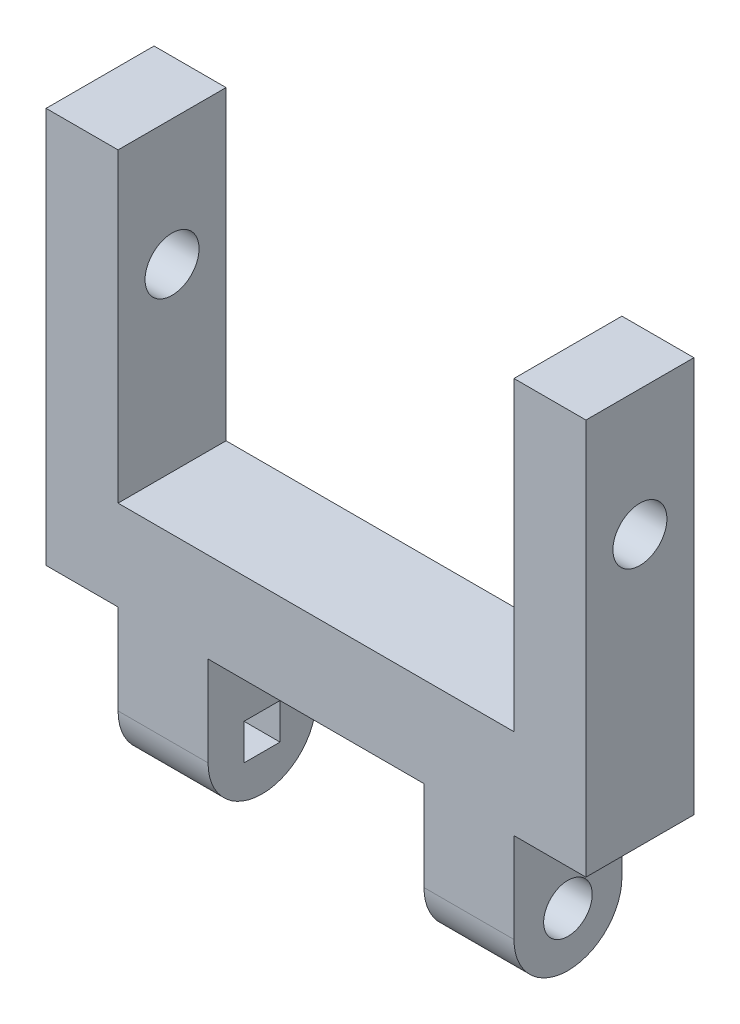
ISO-10303-21;
HEADER;
FILE_DESCRIPTION(('STEP AP214'),'2;1');
FILE_NAME('part.step','',(''),(''),'','','');
FILE_SCHEMA(('AUTOMOTIVE_DESIGN { 1 0 10303 214 1 1 1 1 }'));
ENDSEC;
DATA;
#1=APPLICATION_CONTEXT('core data for automotive mechanical design processes');
#2=APPLICATION_PROTOCOL_DEFINITION('international standard','automotive_design',2000,#1);
#3=PRODUCT_CONTEXT('',#1,'mechanical');
#4=PRODUCT('Part','Part','',(#3));
#5=PRODUCT_RELATED_PRODUCT_CATEGORY('part','',(#4));
#6=PRODUCT_DEFINITION_FORMATION('','',#4);
#7=PRODUCT_DEFINITION_CONTEXT('part definition',#1,'design');
#8=PRODUCT_DEFINITION('design','',#6,#7);
#9=PRODUCT_DEFINITION_SHAPE('','',#8);
#10=(LENGTH_UNIT() NAMED_UNIT(*) SI_UNIT(.MILLI.,.METRE.));
#11=(NAMED_UNIT(*) PLANE_ANGLE_UNIT() SI_UNIT($,.RADIAN.));
#12=(NAMED_UNIT(*) SI_UNIT($,.STERADIAN.) SOLID_ANGLE_UNIT());
#13=UNCERTAINTY_MEASURE_WITH_UNIT(LENGTH_MEASURE(1.E-05),#10,'distance_accuracy_value','');
#14=(GEOMETRIC_REPRESENTATION_CONTEXT(3) GLOBAL_UNCERTAINTY_ASSIGNED_CONTEXT((#13)) GLOBAL_UNIT_ASSIGNED_CONTEXT((#10,
#11,#12)) REPRESENTATION_CONTEXT('',''));
#15=CARTESIAN_POINT('',(0.,0.,0.));
#16=DIRECTION('',(0.,0.,1.));
#17=DIRECTION('',(1.,0.,0.));
#18=AXIS2_PLACEMENT_3D('',#15,#16,#17);
#19=CARTESIAN_POINT('',(0.,0.,0.));
#20=DIRECTION('',(0.,-1.,0.));
#21=DIRECTION('',(0.,0.,-1.));
#22=AXIS2_PLACEMENT_3D('',#19,#20,#21);
#23=PLANE('',#22);
#24=DIRECTION('',(1.,0.,0.));
#25=VECTOR('',#24,1.);
#26=CARTESIAN_POINT('',(-15.,0.,3.));
#27=LINE('',#26,#25);
#28=CARTESIAN_POINT('',(11.,0.,3.));
#29=VERTEX_POINT('',#28);
#30=CARTESIAN_POINT('',(15.,0.,3.));
#31=VERTEX_POINT('',#30);
#32=EDGE_CURVE('E365',#29,#31,#27,.T.);
#33=ORIENTED_EDGE('',*,*,#32,.F.);
#34=DIRECTION('',(0.,0.,1.));
#35=VECTOR('',#34,1.);
#36=CARTESIAN_POINT('',(11.,0.,-3.));
#37=LINE('',#36,#35);
#38=CARTESIAN_POINT('',(11.,0.,-3.));
#39=VERTEX_POINT('',#38);
#40=EDGE_CURVE('E255',#39,#29,#37,.T.);
#41=ORIENTED_EDGE('',*,*,#40,.F.);
#42=DIRECTION('',(-1.,0.,0.));
#43=VECTOR('',#42,1.);
#44=CARTESIAN_POINT('',(-15.,0.,-3.));
#45=LINE('',#44,#43);
#46=CARTESIAN_POINT('',(15.,0.,-3.));
#47=VERTEX_POINT('',#46);
#48=EDGE_CURVE('E357',#47,#39,#45,.T.);
#49=ORIENTED_EDGE('',*,*,#48,.F.);
#50=DIRECTION('',(0.,0.,-1.));
#51=VECTOR('',#50,1.);
#52=CARTESIAN_POINT('',(15.,0.,3.));
#53=LINE('',#52,#51);
#54=EDGE_CURVE('E344',#31,#47,#53,.T.);
#55=ORIENTED_EDGE('',*,*,#54,.F.);
#56=EDGE_LOOP('',(#33,#41,#49,#55));
#57=FACE_BOUND('',#56,.T.);
#58=ADVANCED_FACE('F43',(#57),#23,.T.);
#59=CARTESIAN_POINT('',(6.,0.,-3.));
#60=VERTEX_POINT('',#59);
#61=CARTESIAN_POINT('',(-6.,0.,-3.));
#62=VERTEX_POINT('',#61);
#63=EDGE_CURVE('E362',#60,#62,#45,.T.);
#64=ORIENTED_EDGE('',*,*,#63,.F.);
#65=DIRECTION('',(0.,0.,-1.));
#66=VECTOR('',#65,1.);
#67=CARTESIAN_POINT('',(6.,0.,-3.));
#68=LINE('',#67,#66);
#69=CARTESIAN_POINT('',(6.,0.,3.));
#70=VERTEX_POINT('',#69);
#71=EDGE_CURVE('E251',#70,#60,#68,.T.);
#72=ORIENTED_EDGE('',*,*,#71,.F.);
#73=CARTESIAN_POINT('',(-6.,0.,3.));
#74=VERTEX_POINT('',#73);
#75=EDGE_CURVE('E369',#74,#70,#27,.T.);
#76=ORIENTED_EDGE('',*,*,#75,.F.);
#77=DIRECTION('',(0.,0.,1.));
#78=VECTOR('',#77,1.);
#79=CARTESIAN_POINT('',(-6.,0.,-3.));
#80=LINE('',#79,#78);
#81=EDGE_CURVE('E263',#62,#74,#80,.T.);
#82=ORIENTED_EDGE('',*,*,#81,.F.);
#83=EDGE_LOOP('',(#64,#72,#76,#82));
#84=FACE_BOUND('',#83,.T.);
#85=ADVANCED_FACE('F471',(#84),#23,.T.);
#86=DIRECTION('',(0.,0.,-1.));
#87=VECTOR('',#86,1.);
#88=CARTESIAN_POINT('',(-11.,0.,-3.));
#89=LINE('',#88,#87);
#90=CARTESIAN_POINT('',(-11.,0.,3.));
#91=VERTEX_POINT('',#90);
#92=CARTESIAN_POINT('',(-11.,0.,-3.));
#93=VERTEX_POINT('',#92);
#94=EDGE_CURVE('E259',#91,#93,#89,.T.);
#95=ORIENTED_EDGE('',*,*,#94,.F.);
#96=CARTESIAN_POINT('',(-15.,0.,3.));
#97=VERTEX_POINT('',#96);
#98=EDGE_CURVE('E349',#97,#91,#27,.T.);
#99=ORIENTED_EDGE('',*,*,#98,.F.);
#100=DIRECTION('',(0.,0.,1.));
#101=VECTOR('',#100,1.);
#102=CARTESIAN_POINT('',(-15.,0.,3.));
#103=LINE('',#102,#101);
#104=CARTESIAN_POINT('',(-15.,0.,-3.));
#105=VERTEX_POINT('',#104);
#106=EDGE_CURVE('E361',#105,#97,#103,.T.);
#107=ORIENTED_EDGE('',*,*,#106,.F.);
#108=EDGE_CURVE('E356',#93,#105,#45,.T.);
#109=ORIENTED_EDGE('',*,*,#108,.F.);
#110=EDGE_LOOP('',(#95,#99,#107,#109));
#111=FACE_BOUND('',#110,.T.);
#112=ADVANCED_FACE('F492',(#111),#23,.T.);
#113=CARTESIAN_POINT('',(0.,5.,0.));
#114=DIRECTION('',(0.,-1.,0.));
#115=DIRECTION('',(0.,0.,-1.));
#116=AXIS2_PLACEMENT_3D('',#113,#114,#115);
#117=PLANE('',#116);
#118=DIRECTION('',(0.,0.,1.));
#119=VECTOR('',#118,1.);
#120=CARTESIAN_POINT('',(11.,5.,-3.));
#121=LINE('',#120,#119);
#122=CARTESIAN_POINT('',(11.,5.,-3.));
#123=VERTEX_POINT('',#122);
#124=CARTESIAN_POINT('',(11.,5.,3.));
#125=VERTEX_POINT('',#124);
#126=EDGE_CURVE('E301',#123,#125,#121,.T.);
#127=ORIENTED_EDGE('',*,*,#126,.F.);
#128=DIRECTION('',(-1.,0.,0.));
#129=VECTOR('',#128,1.);
#130=CARTESIAN_POINT('',(-15.,5.,-3.));
#131=LINE('',#130,#129);
#132=CARTESIAN_POINT('',(-11.,5.,-3.));
#133=VERTEX_POINT('',#132);
#134=EDGE_CURVE('E345',#123,#133,#131,.T.);
#135=ORIENTED_EDGE('',*,*,#134,.T.);
#136=DIRECTION('',(0.,0.,-1.));
#137=VECTOR('',#136,1.);
#138=CARTESIAN_POINT('',(-11.,5.,-3.));
#139=LINE('',#138,#137);
#140=CARTESIAN_POINT('',(-11.,5.,3.));
#141=VERTEX_POINT('',#140);
#142=EDGE_CURVE('E305',#141,#133,#139,.T.);
#143=ORIENTED_EDGE('',*,*,#142,.F.);
#144=DIRECTION('',(1.,0.,0.));
#145=VECTOR('',#144,1.);
#146=CARTESIAN_POINT('',(-15.,5.,3.));
#147=LINE('',#146,#145);
#148=EDGE_CURVE('E348',#141,#125,#147,.T.);
#149=ORIENTED_EDGE('',*,*,#148,.T.);
#150=EDGE_LOOP('',(#127,#135,#143,#149));
#151=FACE_BOUND('',#150,.T.);
#152=ADVANCED_FACE('F507',(#151),#117,.F.);
#153=CARTESIAN_POINT('',(15.,5.,3.));
#154=DIRECTION('',(-1.,0.,0.));
#155=DIRECTION('',(0.,0.,1.));
#156=AXIS2_PLACEMENT_3D('',#153,#154,#155);
#157=PLANE('',#156);
#158=CARTESIAN_POINT('',(15.,15.,0.));
#159=DIRECTION('',(-1.,0.,0.));
#160=DIRECTION('',(0.,0.,1.));
#161=AXIS2_PLACEMENT_3D('',#158,#159,#160);
#162=CIRCLE('',#161,1.5);
#163=CARTESIAN_POINT('',(15.,15.,1.5));
#164=VERTEX_POINT('',#163);
#165=EDGE_CURVE('E288',#164,#164,#162,.T.);
#166=ORIENTED_EDGE('',*,*,#165,.T.);
#167=EDGE_LOOP('',(#166));
#168=FACE_BOUND('',#167,.T.);
#169=ORIENTED_EDGE('',*,*,#54,.T.);
#170=DIRECTION('',(0.,-1.,0.));
#171=VECTOR('',#170,1.);
#172=CARTESIAN_POINT('',(15.,5.,-3.));
#173=LINE('',#172,#171);
#174=CARTESIAN_POINT('',(15.,22.,-3.));
#175=VERTEX_POINT('',#174);
#176=EDGE_CURVE('E381',#175,#47,#173,.T.);
#177=ORIENTED_EDGE('',*,*,#176,.F.);
#178=DIRECTION('',(0.,0.,-1.));
#179=VECTOR('',#178,1.);
#180=CARTESIAN_POINT('',(15.,22.,-3.));
#181=LINE('',#180,#179);
#182=CARTESIAN_POINT('',(15.,22.,3.));
#183=VERTEX_POINT('',#182);
#184=EDGE_CURVE('E306',#183,#175,#181,.T.);
#185=ORIENTED_EDGE('',*,*,#184,.F.);
#186=DIRECTION('',(0.,-1.,0.));
#187=VECTOR('',#186,1.);
#188=CARTESIAN_POINT('',(15.,5.,3.));
#189=LINE('',#188,#187);
#190=EDGE_CURVE('E352',#183,#31,#189,.T.);
#191=ORIENTED_EDGE('',*,*,#190,.T.);
#192=EDGE_LOOP('',(#169,#177,#185,#191));
#193=FACE_BOUND('',#192,.T.);
#194=ADVANCED_FACE('F518',(#168,#193),#157,.F.);
#195=CARTESIAN_POINT('',(-15.,5.,-3.));
#196=DIRECTION('',(0.,0.,1.));
#197=DIRECTION('',(1.,0.,0.));
#198=AXIS2_PLACEMENT_3D('',#195,#196,#197);
#199=PLANE('',#198);
#200=DIRECTION('',(0.,1.,0.));
#201=VECTOR('',#200,1.);
#202=CARTESIAN_POINT('',(-6.,-8.,-3.));
#203=LINE('',#202,#201);
#204=CARTESIAN_POINT('',(-6.,-5.,-3.));
#205=VERTEX_POINT('',#204);
#206=EDGE_CURVE('E273',#205,#62,#203,.T.);
#207=ORIENTED_EDGE('',*,*,#206,.F.);
#208=DIRECTION('',(1.,0.,0.));
#209=VECTOR('',#208,1.);
#210=CARTESIAN_POINT('',(-15.,-5.,-3.));
#211=LINE('',#210,#209);
#212=CARTESIAN_POINT('',(-11.,-5.,-3.));
#213=VERTEX_POINT('',#212);
#214=EDGE_CURVE('E414',#205,#213,#211,.F.);
#215=ORIENTED_EDGE('',*,*,#214,.T.);
#216=DIRECTION('',(0.,1.,0.));
#217=VECTOR('',#216,1.);
#218=CARTESIAN_POINT('',(-11.,-8.,-3.));
#219=LINE('',#218,#217);
#220=EDGE_CURVE('E276',#213,#93,#219,.T.);
#221=ORIENTED_EDGE('',*,*,#220,.T.);
#222=ORIENTED_EDGE('',*,*,#108,.T.);
#223=DIRECTION('',(0.,-1.,0.));
#224=VECTOR('',#223,1.);
#225=CARTESIAN_POINT('',(-15.,5.,-3.));
#226=LINE('',#225,#224);
#227=CARTESIAN_POINT('',(-15.,22.,-3.));
#228=VERTEX_POINT('',#227);
#229=EDGE_CURVE('E377',#228,#105,#226,.T.);
#230=ORIENTED_EDGE('',*,*,#229,.F.);
#231=DIRECTION('',(-1.,0.,0.));
#232=VECTOR('',#231,1.);
#233=CARTESIAN_POINT('',(-15.,22.,-3.));
#234=LINE('',#233,#232);
#235=CARTESIAN_POINT('',(-11.,22.,-3.));
#236=VERTEX_POINT('',#235);
#237=EDGE_CURVE('E329',#236,#228,#234,.T.);
#238=ORIENTED_EDGE('',*,*,#237,.F.);
#239=DIRECTION('',(0.,-1.,0.));
#240=VECTOR('',#239,1.);
#241=CARTESIAN_POINT('',(-11.,22.,-3.));
#242=LINE('',#241,#240);
#243=EDGE_CURVE('E333',#236,#133,#242,.T.);
#244=ORIENTED_EDGE('',*,*,#243,.T.);
#245=ORIENTED_EDGE('',*,*,#134,.F.);
#246=DIRECTION('',(0.,-1.,0.));
#247=VECTOR('',#246,1.);
#248=CARTESIAN_POINT('',(11.,22.,-3.));
#249=LINE('',#248,#247);
#250=CARTESIAN_POINT('',(11.,22.,-3.));
#251=VERTEX_POINT('',#250);
#252=EDGE_CURVE('E292',#251,#123,#249,.T.);
#253=ORIENTED_EDGE('',*,*,#252,.F.);
#254=DIRECTION('',(-1.,0.,0.));
#255=VECTOR('',#254,1.);
#256=CARTESIAN_POINT('',(15.,22.,-3.));
#257=LINE('',#256,#255);
#258=EDGE_CURVE('E313',#175,#251,#257,.T.);
#259=ORIENTED_EDGE('',*,*,#258,.F.);
#260=ORIENTED_EDGE('',*,*,#176,.T.);
#261=ORIENTED_EDGE('',*,*,#48,.T.);
#262=DIRECTION('',(0.,1.,0.));
#263=VECTOR('',#262,1.);
#264=CARTESIAN_POINT('',(11.,-8.,-3.));
#265=LINE('',#264,#263);
#266=CARTESIAN_POINT('',(11.,-5.,-3.));
#267=VERTEX_POINT('',#266);
#268=EDGE_CURVE('E248',#267,#39,#265,.T.);
#269=ORIENTED_EDGE('',*,*,#268,.F.);
#270=DIRECTION('',(1.,0.,0.));
#271=VECTOR('',#270,1.);
#272=CARTESIAN_POINT('',(6.,-5.,-3.));
#273=LINE('',#272,#271);
#274=CARTESIAN_POINT('',(6.,-5.,-3.));
#275=VERTEX_POINT('',#274);
#276=EDGE_CURVE('E410',#267,#275,#273,.F.);
#277=ORIENTED_EDGE('',*,*,#276,.T.);
#278=DIRECTION('',(0.,1.,0.));
#279=VECTOR('',#278,1.);
#280=CARTESIAN_POINT('',(6.,-8.,-3.));
#281=LINE('',#280,#279);
#282=EDGE_CURVE('E245',#275,#60,#281,.T.);
#283=ORIENTED_EDGE('',*,*,#282,.T.);
#284=ORIENTED_EDGE('',*,*,#63,.T.);
#285=EDGE_LOOP('',(#207,#215,#221,#222,#230,#238,#244,#245,#253,#259,#260,#261,#269,#277,#283,#284));
#286=FACE_BOUND('',#285,.T.);
#287=ADVANCED_FACE('F479',(#286),#199,.F.);
#288=CARTESIAN_POINT('',(-15.,5.,3.));
#289=DIRECTION('',(1.,0.,0.));
#290=DIRECTION('',(0.,0.,-1.));
#291=AXIS2_PLACEMENT_3D('',#288,#289,#290);
#292=PLANE('',#291);
#293=CARTESIAN_POINT('',(-15.,15.,0.));
#294=DIRECTION('',(1.,0.,0.));
#295=DIRECTION('',(0.,0.,-1.));
#296=AXIS2_PLACEMENT_3D('',#293,#294,#295);
#297=CIRCLE('',#296,1.5);
#298=CARTESIAN_POINT('',(-15.,15.,-1.5));
#299=VERTEX_POINT('',#298);
#300=EDGE_CURVE('E284',#299,#299,#297,.T.);
#301=ORIENTED_EDGE('',*,*,#300,.T.);
#302=EDGE_LOOP('',(#301));
#303=FACE_BOUND('',#302,.T.);
#304=ORIENTED_EDGE('',*,*,#106,.T.);
#305=DIRECTION('',(0.,-1.,0.));
#306=VECTOR('',#305,1.);
#307=CARTESIAN_POINT('',(-15.,5.,3.));
#308=LINE('',#307,#306);
#309=CARTESIAN_POINT('',(-15.,22.,3.));
#310=VERTEX_POINT('',#309);
#311=EDGE_CURVE('E373',#310,#97,#308,.T.);
#312=ORIENTED_EDGE('',*,*,#311,.F.);
#313=DIRECTION('',(0.,0.,1.));
#314=VECTOR('',#313,1.);
#315=CARTESIAN_POINT('',(-15.,22.,-3.));
#316=LINE('',#315,#314);
#317=EDGE_CURVE('E319',#228,#310,#316,.T.);
#318=ORIENTED_EDGE('',*,*,#317,.F.);
#319=ORIENTED_EDGE('',*,*,#229,.T.);
#320=EDGE_LOOP('',(#304,#312,#318,#319));
#321=FACE_BOUND('',#320,.T.);
#322=ADVANCED_FACE('F490',(#303,#321),#292,.F.);
#323=CARTESIAN_POINT('',(-15.,5.,3.));
#324=DIRECTION('',(0.,0.,-1.));
#325=DIRECTION('',(-1.,0.,0.));
#326=AXIS2_PLACEMENT_3D('',#323,#324,#325);
#327=PLANE('',#326);
#328=DIRECTION('',(0.,1.,0.));
#329=VECTOR('',#328,1.);
#330=CARTESIAN_POINT('',(6.,-8.,3.));
#331=LINE('',#330,#329);
#332=CARTESIAN_POINT('',(6.,-5.,3.));
#333=VERTEX_POINT('',#332);
#334=EDGE_CURVE('E242',#333,#70,#331,.T.);
#335=ORIENTED_EDGE('',*,*,#334,.F.);
#336=DIRECTION('',(-1.,0.,0.));
#337=VECTOR('',#336,1.);
#338=CARTESIAN_POINT('',(11.,-5.,3.));
#339=LINE('',#338,#337);
#340=CARTESIAN_POINT('',(11.,-5.,3.));
#341=VERTEX_POINT('',#340);
#342=EDGE_CURVE('E11',#333,#341,#339,.F.);
#343=ORIENTED_EDGE('',*,*,#342,.T.);
#344=DIRECTION('',(0.,1.,0.));
#345=VECTOR('',#344,1.);
#346=CARTESIAN_POINT('',(11.,-8.,3.));
#347=LINE('',#346,#345);
#348=EDGE_CURVE('E239',#341,#29,#347,.T.);
#349=ORIENTED_EDGE('',*,*,#348,.T.);
#350=ORIENTED_EDGE('',*,*,#32,.T.);
#351=ORIENTED_EDGE('',*,*,#190,.F.);
#352=DIRECTION('',(1.,0.,0.));
#353=VECTOR('',#352,1.);
#354=CARTESIAN_POINT('',(15.,22.,3.));
#355=LINE('',#354,#353);
#356=CARTESIAN_POINT('',(11.,22.,3.));
#357=VERTEX_POINT('',#356);
#358=EDGE_CURVE('E300',#357,#183,#355,.T.);
#359=ORIENTED_EDGE('',*,*,#358,.F.);
#360=DIRECTION('',(0.,-1.,0.));
#361=VECTOR('',#360,1.);
#362=CARTESIAN_POINT('',(11.,22.,3.));
#363=LINE('',#362,#361);
#364=EDGE_CURVE('E296',#357,#125,#363,.T.);
#365=ORIENTED_EDGE('',*,*,#364,.T.);
#366=ORIENTED_EDGE('',*,*,#148,.F.);
#367=DIRECTION('',(0.,-1.,0.));
#368=VECTOR('',#367,1.);
#369=CARTESIAN_POINT('',(-11.,22.,3.));
#370=LINE('',#369,#368);
#371=CARTESIAN_POINT('',(-11.,22.,3.));
#372=VERTEX_POINT('',#371);
#373=EDGE_CURVE('E340',#372,#141,#370,.T.);
#374=ORIENTED_EDGE('',*,*,#373,.F.);
#375=DIRECTION('',(1.,0.,0.));
#376=VECTOR('',#375,1.);
#377=CARTESIAN_POINT('',(-15.,22.,3.));
#378=LINE('',#377,#376);
#379=EDGE_CURVE('E323',#310,#372,#378,.T.);
#380=ORIENTED_EDGE('',*,*,#379,.F.);
#381=ORIENTED_EDGE('',*,*,#311,.T.);
#382=ORIENTED_EDGE('',*,*,#98,.T.);
#383=DIRECTION('',(0.,1.,0.));
#384=VECTOR('',#383,1.);
#385=CARTESIAN_POINT('',(-11.,-8.,3.));
#386=LINE('',#385,#384);
#387=CARTESIAN_POINT('',(-11.,-5.,3.));
#388=VERTEX_POINT('',#387);
#389=EDGE_CURVE('E267',#388,#91,#386,.T.);
#390=ORIENTED_EDGE('',*,*,#389,.F.);
#391=DIRECTION('',(-1.,0.,0.));
#392=VECTOR('',#391,1.);
#393=CARTESIAN_POINT('',(-15.,-5.,3.));
#394=LINE('',#393,#392);
#395=CARTESIAN_POINT('',(-6.,-5.,3.));
#396=VERTEX_POINT('',#395);
#397=EDGE_CURVE('E53',#388,#396,#394,.F.);
#398=ORIENTED_EDGE('',*,*,#397,.T.);
#399=DIRECTION('',(0.,1.,0.));
#400=VECTOR('',#399,1.);
#401=CARTESIAN_POINT('',(-6.,-8.,3.));
#402=LINE('',#401,#400);
#403=EDGE_CURVE('E270',#396,#74,#402,.T.);
#404=ORIENTED_EDGE('',*,*,#403,.T.);
#405=ORIENTED_EDGE('',*,*,#75,.T.);
#406=EDGE_LOOP('',(#335,#343,#349,#350,#351,#359,#365,#366,#374,#380,#381,#382,#390,#398,#404,#405));
#407=FACE_BOUND('',#406,.T.);
#408=ADVANCED_FACE('F454',(#407),#327,.F.);
#409=CARTESIAN_POINT('',(-11.,22.,-3.));
#410=DIRECTION('',(-1.,0.,0.));
#411=DIRECTION('',(0.,0.,1.));
#412=AXIS2_PLACEMENT_3D('',#409,#410,#411);
#413=PLANE('',#412);
#414=CARTESIAN_POINT('',(-11.,15.,0.));
#415=DIRECTION('',(-1.,0.,0.));
#416=DIRECTION('',(0.,0.,1.));
#417=AXIS2_PLACEMENT_3D('',#414,#415,#416);
#418=CIRCLE('',#417,1.5);
#419=CARTESIAN_POINT('',(-11.,15.,1.5));
#420=VERTEX_POINT('',#419);
#421=EDGE_CURVE('E280',#420,#420,#418,.T.);
#422=ORIENTED_EDGE('',*,*,#421,.T.);
#423=EDGE_LOOP('',(#422));
#424=FACE_BOUND('',#423,.T.);
#425=ORIENTED_EDGE('',*,*,#142,.T.);
#426=ORIENTED_EDGE('',*,*,#243,.F.);
#427=DIRECTION('',(0.,0.,-1.));
#428=VECTOR('',#427,1.);
#429=CARTESIAN_POINT('',(-11.,22.,-3.));
#430=LINE('',#429,#428);
#431=EDGE_CURVE('E326',#372,#236,#430,.T.);
#432=ORIENTED_EDGE('',*,*,#431,.F.);
#433=ORIENTED_EDGE('',*,*,#373,.T.);
#434=EDGE_LOOP('',(#425,#426,#432,#433));
#435=FACE_BOUND('',#434,.T.);
#436=ADVANCED_FACE('F505',(#424,#435),#413,.F.);
#437=CARTESIAN_POINT('',(0.,22.,0.));
#438=DIRECTION('',(0.,1.,0.));
#439=DIRECTION('',(0.,0.,1.));
#440=AXIS2_PLACEMENT_3D('',#437,#438,#439);
#441=PLANE('',#440);
#442=ORIENTED_EDGE('',*,*,#317,.T.);
#443=ORIENTED_EDGE('',*,*,#379,.T.);
#444=ORIENTED_EDGE('',*,*,#431,.T.);
#445=ORIENTED_EDGE('',*,*,#237,.T.);
#446=EDGE_LOOP('',(#442,#443,#444,#445));
#447=FACE_BOUND('',#446,.T.);
#448=ADVANCED_FACE('F500',(#447),#441,.T.);
#449=CARTESIAN_POINT('',(11.,22.,-3.));
#450=DIRECTION('',(1.,0.,0.));
#451=DIRECTION('',(0.,0.,-1.));
#452=AXIS2_PLACEMENT_3D('',#449,#450,#451);
#453=PLANE('',#452);
#454=CARTESIAN_POINT('',(11.,15.,0.));
#455=DIRECTION('',(1.,0.,0.));
#456=DIRECTION('',(0.,0.,-1.));
#457=AXIS2_PLACEMENT_3D('',#454,#455,#456);
#458=CIRCLE('',#457,1.5);
#459=CARTESIAN_POINT('',(11.,15.,-1.5));
#460=VERTEX_POINT('',#459);
#461=EDGE_CURVE('E279',#460,#460,#458,.T.);
#462=ORIENTED_EDGE('',*,*,#461,.T.);
#463=EDGE_LOOP('',(#462));
#464=FACE_BOUND('',#463,.T.);
#465=ORIENTED_EDGE('',*,*,#126,.T.);
#466=ORIENTED_EDGE('',*,*,#364,.F.);
#467=DIRECTION('',(0.,0.,1.));
#468=VECTOR('',#467,1.);
#469=CARTESIAN_POINT('',(11.,22.,-3.));
#470=LINE('',#469,#468);
#471=EDGE_CURVE('E310',#251,#357,#470,.T.);
#472=ORIENTED_EDGE('',*,*,#471,.F.);
#473=ORIENTED_EDGE('',*,*,#252,.T.);
#474=EDGE_LOOP('',(#465,#466,#472,#473));
#475=FACE_BOUND('',#474,.T.);
#476=ADVANCED_FACE('F512',(#464,#475),#453,.F.);
#477=CARTESIAN_POINT('',(0.,22.,0.));
#478=DIRECTION('',(0.,-1.,0.));
#479=DIRECTION('',(0.,0.,-1.));
#480=AXIS2_PLACEMENT_3D('',#477,#478,#479);
#481=PLANE('',#480);
#482=ORIENTED_EDGE('',*,*,#184,.T.);
#483=ORIENTED_EDGE('',*,*,#258,.T.);
#484=ORIENTED_EDGE('',*,*,#471,.T.);
#485=ORIENTED_EDGE('',*,*,#358,.T.);
#486=EDGE_LOOP('',(#482,#483,#484,#485));
#487=FACE_BOUND('',#486,.T.);
#488=ADVANCED_FACE('F516',(#487),#481,.F.);
#489=CARTESIAN_POINT('',(61.,15.,0.));
#490=DIRECTION('',(-1.,0.,0.));
#491=DIRECTION('',(0.,0.,1.));
#492=AXIS2_PLACEMENT_3D('',#489,#490,#491);
#493=CYLINDRICAL_SURFACE('',#492,1.5);
#494=ORIENTED_EDGE('',*,*,#461,.F.);
#495=EDGE_LOOP('',(#494));
#496=FACE_BOUND('',#495,.T.);
#497=ORIENTED_EDGE('',*,*,#165,.F.);
#498=EDGE_LOOP('',(#497));
#499=FACE_BOUND('',#498,.T.);
#500=ADVANCED_FACE('F569',(#496,#499),#493,.F.);
#501=ORIENTED_EDGE('',*,*,#421,.F.);
#502=EDGE_LOOP('',(#501));
#503=FACE_BOUND('',#502,.T.);
#504=ORIENTED_EDGE('',*,*,#300,.F.);
#505=EDGE_LOOP('',(#504));
#506=FACE_BOUND('',#505,.T.);
#507=ADVANCED_FACE('F615',(#503,#506),#493,.F.);
#508=CARTESIAN_POINT('',(-11.,-8.,-3.));
#509=DIRECTION('',(1.,0.,0.));
#510=DIRECTION('',(0.,0.,-1.));
#511=AXIS2_PLACEMENT_3D('',#508,#509,#510);
#512=PLANE('',#511);
#513=DIRECTION('',(0.,0.,-1.));
#514=VECTOR('',#513,1.);
#515=CARTESIAN_POINT('',(-11.,-4.,-1.));
#516=LINE('',#515,#514);
#517=CARTESIAN_POINT('',(-11.,-4.,1.));
#518=VERTEX_POINT('',#517);
#519=CARTESIAN_POINT('',(-11.,-4.,-1.));
#520=VERTEX_POINT('',#519);
#521=EDGE_CURVE('E209',#518,#520,#516,.T.);
#522=ORIENTED_EDGE('',*,*,#521,.F.);
#523=DIRECTION('',(0.,1.,0.));
#524=VECTOR('',#523,1.);
#525=CARTESIAN_POINT('',(-11.,-6.,1.));
#526=LINE('',#525,#524);
#527=CARTESIAN_POINT('',(-11.,-6.,1.));
#528=VERTEX_POINT('',#527);
#529=EDGE_CURVE('E215',#528,#518,#526,.T.);
#530=ORIENTED_EDGE('',*,*,#529,.F.);
#531=DIRECTION('',(0.,0.,1.));
#532=VECTOR('',#531,1.);
#533=CARTESIAN_POINT('',(-11.,-6.,-1.));
#534=LINE('',#533,#532);
#535=CARTESIAN_POINT('',(-11.,-6.,-1.));
#536=VERTEX_POINT('',#535);
#537=EDGE_CURVE('E220',#536,#528,#534,.T.);
#538=ORIENTED_EDGE('',*,*,#537,.F.);
#539=DIRECTION('',(0.,-1.,0.));
#540=VECTOR('',#539,1.);
#541=CARTESIAN_POINT('',(-11.,-6.,-1.));
#542=LINE('',#541,#540);
#543=EDGE_CURVE('E197',#520,#536,#542,.T.);
#544=ORIENTED_EDGE('',*,*,#543,.F.);
#545=EDGE_LOOP('',(#522,#530,#538,#544));
#546=FACE_BOUND('',#545,.T.);
#547=ORIENTED_EDGE('',*,*,#220,.F.);
#548=CARTESIAN_POINT('',(-11.,-5.,0.));
#549=DIRECTION('',(1.,0.,0.));
#550=DIRECTION('',(0.,0.,-1.));
#551=AXIS2_PLACEMENT_3D('',#548,#549,#550);
#552=CIRCLE('',#551,3.);
#553=CARTESIAN_POINT('',(-11.,-8.,0.));
#554=VERTEX_POINT('',#553);
#555=EDGE_CURVE('E421',#213,#554,#552,.F.);
#556=ORIENTED_EDGE('',*,*,#555,.T.);
#557=CARTESIAN_POINT('',(-11.,-5.,0.));
#558=DIRECTION('',(1.,0.,0.));
#559=DIRECTION('',(0.,0.,-1.));
#560=AXIS2_PLACEMENT_3D('',#557,#558,#559);
#561=CIRCLE('',#560,3.);
#562=EDGE_CURVE('E418',#554,#388,#561,.F.);
#563=ORIENTED_EDGE('',*,*,#562,.T.);
#564=ORIENTED_EDGE('',*,*,#389,.T.);
#565=ORIENTED_EDGE('',*,*,#94,.T.);
#566=EDGE_LOOP('',(#547,#556,#563,#564,#565));
#567=FACE_BOUND('',#566,.T.);
#568=ADVANCED_FACE('F217',(#546,#567),#512,.F.);
#569=CARTESIAN_POINT('',(-6.,-8.,-3.));
#570=DIRECTION('',(-1.,0.,0.));
#571=DIRECTION('',(0.,0.,1.));
#572=AXIS2_PLACEMENT_3D('',#569,#570,#571);
#573=PLANE('',#572);
#574=DIRECTION('',(0.,0.,1.));
#575=VECTOR('',#574,1.);
#576=CARTESIAN_POINT('',(-6.,-6.,-3.));
#577=LINE('',#576,#575);
#578=CARTESIAN_POINT('',(-6.,-6.,-1.));
#579=VERTEX_POINT('',#578);
#580=CARTESIAN_POINT('',(-6.,-6.,1.));
#581=VERTEX_POINT('',#580);
#582=EDGE_CURVE('E396',#579,#581,#577,.T.);
#583=ORIENTED_EDGE('',*,*,#582,.T.);
#584=DIRECTION('',(0.,1.,0.));
#585=VECTOR('',#584,1.);
#586=CARTESIAN_POINT('',(-6.,-8.,1.));
#587=LINE('',#586,#585);
#588=CARTESIAN_POINT('',(-6.,-4.,1.));
#589=VERTEX_POINT('',#588);
#590=EDGE_CURVE('E400',#581,#589,#587,.T.);
#591=ORIENTED_EDGE('',*,*,#590,.T.);
#592=DIRECTION('',(0.,0.,-1.));
#593=VECTOR('',#592,1.);
#594=CARTESIAN_POINT('',(-6.,-4.,-3.));
#595=LINE('',#594,#593);
#596=CARTESIAN_POINT('',(-6.,-4.,-1.));
#597=VERTEX_POINT('',#596);
#598=EDGE_CURVE('E385',#589,#597,#595,.T.);
#599=ORIENTED_EDGE('',*,*,#598,.T.);
#600=DIRECTION('',(0.,-1.,0.));
#601=VECTOR('',#600,1.);
#602=CARTESIAN_POINT('',(-6.,-8.,-1.));
#603=LINE('',#602,#601);
#604=EDGE_CURVE('E200',#597,#579,#603,.T.);
#605=ORIENTED_EDGE('',*,*,#604,.T.);
#606=EDGE_LOOP('',(#583,#591,#599,#605));
#607=FACE_BOUND('',#606,.T.);
#608=CARTESIAN_POINT('',(-6.,-5.,0.));
#609=DIRECTION('',(-1.,0.,0.));
#610=DIRECTION('',(0.,0.,1.));
#611=AXIS2_PLACEMENT_3D('',#608,#609,#610);
#612=CIRCLE('',#611,3.);
#613=CARTESIAN_POINT('',(-6.,-8.,0.));
#614=VERTEX_POINT('',#613);
#615=EDGE_CURVE('E404',#396,#614,#612,.F.);
#616=ORIENTED_EDGE('',*,*,#615,.T.);
#617=CARTESIAN_POINT('',(-6.,-5.,0.));
#618=DIRECTION('',(-1.,0.,0.));
#619=DIRECTION('',(0.,0.,1.));
#620=AXIS2_PLACEMENT_3D('',#617,#618,#619);
#621=CIRCLE('',#620,3.);
#622=EDGE_CURVE('E407',#614,#205,#621,.F.);
#623=ORIENTED_EDGE('',*,*,#622,.T.);
#624=ORIENTED_EDGE('',*,*,#206,.T.);
#625=ORIENTED_EDGE('',*,*,#81,.T.);
#626=ORIENTED_EDGE('',*,*,#403,.F.);
#627=EDGE_LOOP('',(#616,#623,#624,#625,#626));
#628=FACE_BOUND('',#627,.T.);
#629=ADVANCED_FACE('F473',(#607,#628),#573,.F.);
#630=CARTESIAN_POINT('',(11.,-8.,-3.));
#631=DIRECTION('',(-1.,0.,0.));
#632=DIRECTION('',(0.,0.,1.));
#633=AXIS2_PLACEMENT_3D('',#630,#631,#632);
#634=PLANE('',#633);
#635=CARTESIAN_POINT('',(11.,-5.,0.));
#636=DIRECTION('',(1.,0.,0.));
#637=DIRECTION('',(0.,0.,-1.));
#638=AXIS2_PLACEMENT_3D('',#635,#636,#637);
#639=CIRCLE('',#638,1.35);
#640=CARTESIAN_POINT('',(11.,-5.,-1.35));
#641=VERTEX_POINT('',#640);
#642=EDGE_CURVE('E230',#641,#641,#639,.T.);
#643=ORIENTED_EDGE('',*,*,#642,.F.);
#644=EDGE_LOOP('',(#643));
#645=FACE_BOUND('',#644,.T.);
#646=CARTESIAN_POINT('',(11.,-5.,0.));
#647=DIRECTION('',(-1.,0.,0.));
#648=DIRECTION('',(0.,0.,1.));
#649=AXIS2_PLACEMENT_3D('',#646,#647,#648);
#650=CIRCLE('',#649,3.);
#651=CARTESIAN_POINT('',(11.,-8.,0.));
#652=VERTEX_POINT('',#651);
#653=EDGE_CURVE('E424',#341,#652,#650,.F.);
#654=ORIENTED_EDGE('',*,*,#653,.T.);
#655=CARTESIAN_POINT('',(11.,-5.,0.));
#656=DIRECTION('',(-1.,0.,0.));
#657=DIRECTION('',(0.,0.,1.));
#658=AXIS2_PLACEMENT_3D('',#655,#656,#657);
#659=CIRCLE('',#658,3.);
#660=EDGE_CURVE('E427',#652,#267,#659,.F.);
#661=ORIENTED_EDGE('',*,*,#660,.T.);
#662=ORIENTED_EDGE('',*,*,#268,.T.);
#663=ORIENTED_EDGE('',*,*,#40,.T.);
#664=ORIENTED_EDGE('',*,*,#348,.F.);
#665=EDGE_LOOP('',(#654,#661,#662,#663,#664));
#666=FACE_BOUND('',#665,.T.);
#667=ADVANCED_FACE('F457',(#645,#666),#634,.F.);
#668=CARTESIAN_POINT('',(6.,-8.,-3.));
#669=DIRECTION('',(1.,0.,0.));
#670=DIRECTION('',(0.,0.,-1.));
#671=AXIS2_PLACEMENT_3D('',#668,#669,#670);
#672=PLANE('',#671);
#673=CARTESIAN_POINT('',(6.,-5.,0.));
#674=DIRECTION('',(1.,0.,0.));
#675=DIRECTION('',(0.,0.,-1.));
#676=AXIS2_PLACEMENT_3D('',#673,#674,#675);
#677=CIRCLE('',#676,1.35);
#678=CARTESIAN_POINT('',(6.,-5.,-1.35));
#679=VERTEX_POINT('',#678);
#680=EDGE_CURVE('E238',#679,#679,#677,.T.);
#681=ORIENTED_EDGE('',*,*,#680,.T.);
#682=EDGE_LOOP('',(#681));
#683=FACE_BOUND('',#682,.T.);
#684=ORIENTED_EDGE('',*,*,#282,.F.);
#685=CARTESIAN_POINT('',(6.,-5.,0.));
#686=DIRECTION('',(1.,0.,0.));
#687=DIRECTION('',(0.,0.,-1.));
#688=AXIS2_PLACEMENT_3D('',#685,#686,#687);
#689=CIRCLE('',#688,3.);
#690=CARTESIAN_POINT('',(6.,-8.,0.));
#691=VERTEX_POINT('',#690);
#692=EDGE_CURVE('E66',#275,#691,#689,.F.);
#693=ORIENTED_EDGE('',*,*,#692,.T.);
#694=CARTESIAN_POINT('',(6.,-5.,0.));
#695=DIRECTION('',(1.,0.,0.));
#696=DIRECTION('',(0.,0.,-1.));
#697=AXIS2_PLACEMENT_3D('',#694,#695,#696);
#698=CIRCLE('',#697,3.);
#699=EDGE_CURVE('E61',#691,#333,#698,.F.);
#700=ORIENTED_EDGE('',*,*,#699,.T.);
#701=ORIENTED_EDGE('',*,*,#334,.T.);
#702=ORIENTED_EDGE('',*,*,#71,.T.);
#703=EDGE_LOOP('',(#684,#693,#700,#701,#702));
#704=FACE_BOUND('',#703,.T.);
#705=ADVANCED_FACE('F719',(#683,#704),#672,.F.);
#706=CARTESIAN_POINT('',(3.,-5.,0.));
#707=DIRECTION('',(1.,0.,0.));
#708=DIRECTION('',(0.,0.,-1.));
#709=AXIS2_PLACEMENT_3D('',#706,#707,#708);
#710=CYLINDRICAL_SURFACE('',#709,1.35);
#711=ORIENTED_EDGE('',*,*,#642,.T.);
#712=EDGE_LOOP('',(#711));
#713=FACE_BOUND('',#712,.T.);
#714=ORIENTED_EDGE('',*,*,#680,.F.);
#715=EDGE_LOOP('',(#714));
#716=FACE_BOUND('',#715,.T.);
#717=ADVANCED_FACE('F730',(#713,#716),#710,.F.);
#718=CARTESIAN_POINT('',(-3.,-6.,1.));
#719=DIRECTION('',(0.,0.,1.));
#720=DIRECTION('',(1.,0.,0.));
#721=AXIS2_PLACEMENT_3D('',#718,#719,#720);
#722=PLANE('',#721);
#723=DIRECTION('',(-1.,0.,0.));
#724=VECTOR('',#723,1.);
#725=CARTESIAN_POINT('',(-3.,-6.,1.));
#726=LINE('',#725,#724);
#727=EDGE_CURVE('E227',#581,#528,#726,.T.);
#728=ORIENTED_EDGE('',*,*,#727,.T.);
#729=ORIENTED_EDGE('',*,*,#529,.T.);
#730=DIRECTION('',(-1.,0.,0.));
#731=VECTOR('',#730,1.);
#732=CARTESIAN_POINT('',(-3.,-4.,1.));
#733=LINE('',#732,#731);
#734=EDGE_CURVE('E205',#589,#518,#733,.T.);
#735=ORIENTED_EDGE('',*,*,#734,.F.);
#736=ORIENTED_EDGE('',*,*,#590,.F.);
#737=EDGE_LOOP('',(#728,#729,#735,#736));
#738=FACE_BOUND('',#737,.T.);
#739=ADVANCED_FACE('F741',(#738),#722,.F.);
#740=CARTESIAN_POINT('',(-3.,-6.,-1.));
#741=DIRECTION('',(0.,-1.,0.));
#742=DIRECTION('',(0.,0.,-1.));
#743=AXIS2_PLACEMENT_3D('',#740,#741,#742);
#744=PLANE('',#743);
#745=DIRECTION('',(-1.,0.,0.));
#746=VECTOR('',#745,1.);
#747=CARTESIAN_POINT('',(-3.,-6.,-1.));
#748=LINE('',#747,#746);
#749=EDGE_CURVE('E204',#579,#536,#748,.T.);
#750=ORIENTED_EDGE('',*,*,#749,.T.);
#751=ORIENTED_EDGE('',*,*,#537,.T.);
#752=ORIENTED_EDGE('',*,*,#727,.F.);
#753=ORIENTED_EDGE('',*,*,#582,.F.);
#754=EDGE_LOOP('',(#750,#751,#752,#753));
#755=FACE_BOUND('',#754,.T.);
#756=ADVANCED_FACE('F752',(#755),#744,.F.);
#757=CARTESIAN_POINT('',(-3.,-6.,-1.));
#758=DIRECTION('',(0.,0.,-1.));
#759=DIRECTION('',(-1.,0.,0.));
#760=AXIS2_PLACEMENT_3D('',#757,#758,#759);
#761=PLANE('',#760);
#762=DIRECTION('',(-1.,0.,0.));
#763=VECTOR('',#762,1.);
#764=CARTESIAN_POINT('',(-3.,-4.,-1.));
#765=LINE('',#764,#763);
#766=EDGE_CURVE('E192',#597,#520,#765,.T.);
#767=ORIENTED_EDGE('',*,*,#766,.T.);
#768=ORIENTED_EDGE('',*,*,#543,.T.);
#769=ORIENTED_EDGE('',*,*,#749,.F.);
#770=ORIENTED_EDGE('',*,*,#604,.F.);
#771=EDGE_LOOP('',(#767,#768,#769,#770));
#772=FACE_BOUND('',#771,.T.);
#773=ADVANCED_FACE('F194',(#772),#761,.F.);
#774=CARTESIAN_POINT('',(-3.,-4.,-1.));
#775=DIRECTION('',(0.,1.,0.));
#776=DIRECTION('',(0.,0.,1.));
#777=AXIS2_PLACEMENT_3D('',#774,#775,#776);
#778=PLANE('',#777);
#779=ORIENTED_EDGE('',*,*,#734,.T.);
#780=ORIENTED_EDGE('',*,*,#521,.T.);
#781=ORIENTED_EDGE('',*,*,#766,.F.);
#782=ORIENTED_EDGE('',*,*,#598,.F.);
#783=EDGE_LOOP('',(#779,#780,#781,#782));
#784=FACE_BOUND('',#783,.T.);
#785=ADVANCED_FACE('F210',(#784),#778,.F.);
#786=CARTESIAN_POINT('',(0.,-5.,0.));
#787=DIRECTION('',(-1.,0.,0.));
#788=DIRECTION('',(0.,0.,1.));
#789=AXIS2_PLACEMENT_3D('',#786,#787,#788);
#790=CYLINDRICAL_SURFACE('',#789,3.);
#791=ORIENTED_EDGE('',*,*,#397,.F.);
#792=ORIENTED_EDGE('',*,*,#562,.F.);
#793=DIRECTION('',(-1.,0.,0.));
#794=VECTOR('',#793,1.);
#795=CARTESIAN_POINT('',(0.,-8.,0.));
#796=LINE('',#795,#794);
#797=EDGE_CURVE('E435',#614,#554,#796,.T.);
#798=ORIENTED_EDGE('',*,*,#797,.F.);
#799=ORIENTED_EDGE('',*,*,#615,.F.);
#800=EDGE_LOOP('',(#791,#792,#798,#799));
#801=FACE_BOUND('',#800,.T.);
#802=ADVANCED_FACE('F781',(#801),#790,.T.);
#803=CARTESIAN_POINT('',(0.,-5.,0.));
#804=DIRECTION('',(1.,0.,0.));
#805=DIRECTION('',(0.,0.,-1.));
#806=AXIS2_PLACEMENT_3D('',#803,#804,#805);
#807=CYLINDRICAL_SURFACE('',#806,3.);
#808=ORIENTED_EDGE('',*,*,#555,.F.);
#809=ORIENTED_EDGE('',*,*,#214,.F.);
#810=ORIENTED_EDGE('',*,*,#622,.F.);
#811=ORIENTED_EDGE('',*,*,#797,.T.);
#812=EDGE_LOOP('',(#808,#809,#810,#811));
#813=FACE_BOUND('',#812,.T.);
#814=ADVANCED_FACE('F790',(#813),#807,.T.);
#815=CARTESIAN_POINT('',(0.,-5.,0.));
#816=DIRECTION('',(1.,0.,0.));
#817=DIRECTION('',(0.,0.,-1.));
#818=AXIS2_PLACEMENT_3D('',#815,#816,#817);
#819=CYLINDRICAL_SURFACE('',#818,3.);
#820=ORIENTED_EDGE('',*,*,#342,.F.);
#821=ORIENTED_EDGE('',*,*,#699,.F.);
#822=DIRECTION('',(-1.,0.,0.));
#823=VECTOR('',#822,1.);
#824=CARTESIAN_POINT('',(6.,-8.,0.));
#825=LINE('',#824,#823);
#826=EDGE_CURVE('E47',#652,#691,#825,.T.);
#827=ORIENTED_EDGE('',*,*,#826,.F.);
#828=ORIENTED_EDGE('',*,*,#653,.F.);
#829=EDGE_LOOP('',(#820,#821,#827,#828));
#830=FACE_BOUND('',#829,.T.);
#831=ADVANCED_FACE('F45',(#830),#819,.T.);
#832=CARTESIAN_POINT('',(0.,-5.,0.));
#833=DIRECTION('',(-1.,0.,0.));
#834=DIRECTION('',(0.,0.,1.));
#835=AXIS2_PLACEMENT_3D('',#832,#833,#834);
#836=CYLINDRICAL_SURFACE('',#835,3.);
#837=ORIENTED_EDGE('',*,*,#692,.F.);
#838=ORIENTED_EDGE('',*,*,#276,.F.);
#839=ORIENTED_EDGE('',*,*,#660,.F.);
#840=ORIENTED_EDGE('',*,*,#826,.T.);
#841=EDGE_LOOP('',(#837,#838,#839,#840));
#842=FACE_BOUND('',#841,.T.);
#843=ADVANCED_FACE('F447',(#842),#836,.T.);
#844=CLOSED_SHELL('',(#58,#85,#112,#152,#194,#287,#322,#408,#436,#448,#476,#488,#500,#507,#568,
#629,#667,#705,#717,#739,#756,#773,#785,#802,#814,#831,#843));
#845=MANIFOLD_SOLID_BREP('B2',#844);
#846=ADVANCED_BREP_SHAPE_REPRESENTATION('',(#18,#845),#14);
#847=SHAPE_DEFINITION_REPRESENTATION(#9,#846);
ENDSEC;
END-ISO-10303-21;
